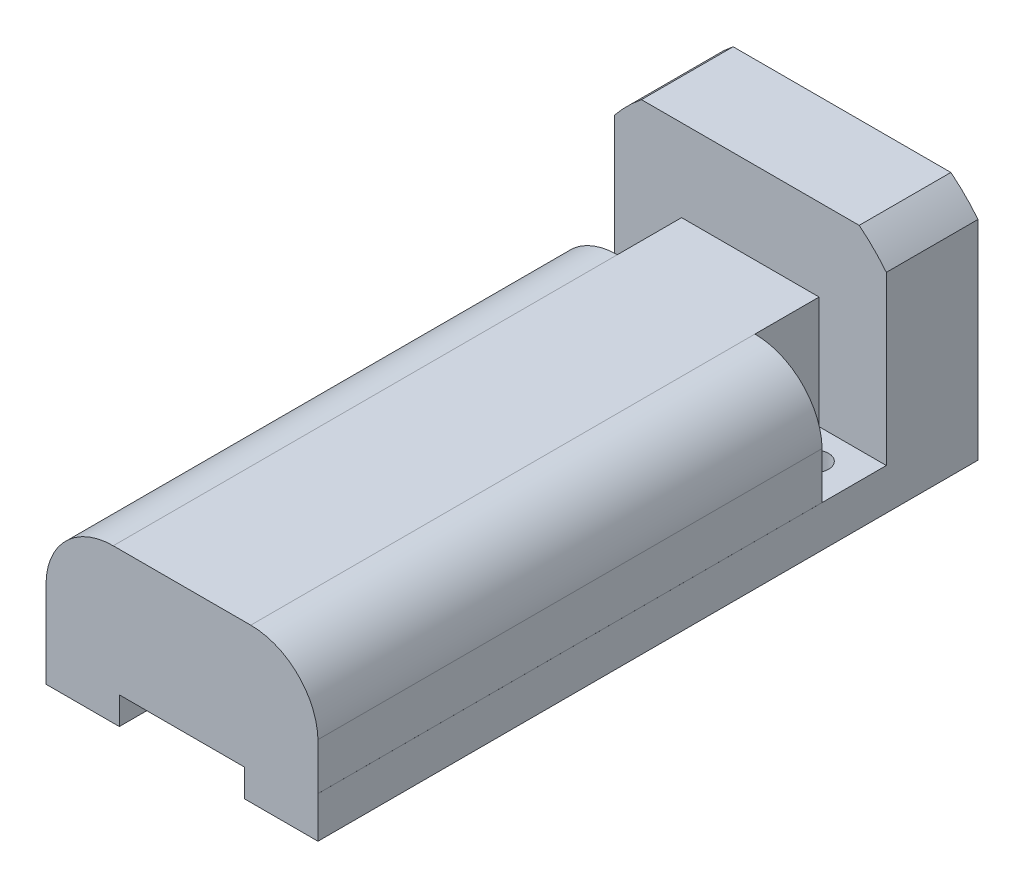
ISO-10303-21;
HEADER;
FILE_DESCRIPTION(('STEP AP214'),'2;1');
FILE_NAME('part.step','',(''),(''),'','','');
FILE_SCHEMA(('AUTOMOTIVE_DESIGN { 1 0 10303 214 1 1 1 1 }'));
ENDSEC;
DATA;
#1=APPLICATION_CONTEXT('core data for automotive mechanical design processes');
#2=APPLICATION_PROTOCOL_DEFINITION('international standard','automotive_design',2000,#1);
#3=PRODUCT_CONTEXT('',#1,'mechanical');
#4=PRODUCT('Part','Part','',(#3));
#5=PRODUCT_RELATED_PRODUCT_CATEGORY('part','',(#4));
#6=PRODUCT_DEFINITION_FORMATION('','',#4);
#7=PRODUCT_DEFINITION_CONTEXT('part definition',#1,'design');
#8=PRODUCT_DEFINITION('design','',#6,#7);
#9=PRODUCT_DEFINITION_SHAPE('','',#8);
#10=(LENGTH_UNIT() NAMED_UNIT(*) SI_UNIT(.MILLI.,.METRE.));
#11=(NAMED_UNIT(*) PLANE_ANGLE_UNIT() SI_UNIT($,.RADIAN.));
#12=(NAMED_UNIT(*) SI_UNIT($,.STERADIAN.) SOLID_ANGLE_UNIT());
#13=UNCERTAINTY_MEASURE_WITH_UNIT(LENGTH_MEASURE(1.E-05),#10,'distance_accuracy_value','');
#14=(GEOMETRIC_REPRESENTATION_CONTEXT(3) GLOBAL_UNCERTAINTY_ASSIGNED_CONTEXT((#13)) GLOBAL_UNIT_ASSIGNED_CONTEXT((#10,
#11,#12)) REPRESENTATION_CONTEXT('',''));
#15=CARTESIAN_POINT('',(0.,0.,0.));
#16=DIRECTION('',(0.,0.,1.));
#17=DIRECTION('',(1.,0.,0.));
#18=AXIS2_PLACEMENT_3D('',#15,#16,#17);
#19=CARTESIAN_POINT('',(8.35,4.5,-72.));
#20=DIRECTION('',(0.,-1.,0.));
#21=DIRECTION('',(1.,0.,0.));
#22=AXIS2_PLACEMENT_3D('',#19,#20,#21);
#23=PLANE('',#22);
#24=CARTESIAN_POINT('',(-10.5425,4.49999999999998,-58.5));
#25=DIRECTION('',(0.,1.,0.));
#26=DIRECTION('',(-1.,0.,0.));
#27=AXIS2_PLACEMENT_3D('',#24,#25,#26);
#28=CIRCLE('',#27,1.5);
#29=CARTESIAN_POINT('',(-12.0425,4.49999999999998,-58.5));
#30=VERTEX_POINT('',#29);
#31=EDGE_CURVE('E269',#30,#30,#28,.T.);
#32=ORIENTED_EDGE('',*,*,#31,.F.);
#33=EDGE_LOOP('',(#32));
#34=FACE_BOUND('',#33,.T.);
#35=DIRECTION('',(0.,0.,1.));
#36=VECTOR('',#35,1.);
#37=CARTESIAN_POINT('',(-7.5,4.5,-81.3665304068643));
#38=LINE('',#37,#36);
#39=CARTESIAN_POINT('',(-7.5,4.5,-62.));
#40=VERTEX_POINT('',#39);
#41=CARTESIAN_POINT('',(-7.5,4.5,-55.));
#42=VERTEX_POINT('',#41);
#43=EDGE_CURVE('E304',#40,#42,#38,.T.);
#44=ORIENTED_EDGE('',*,*,#43,.F.);
#45=DIRECTION('',(1.,0.,0.));
#46=VECTOR('',#45,1.);
#47=CARTESIAN_POINT('',(-14.835,4.5,-62.));
#48=LINE('',#47,#46);
#49=CARTESIAN_POINT('',(-14.835,4.5,-62.));
#50=VERTEX_POINT('',#49);
#51=EDGE_CURVE('E383',#50,#40,#48,.T.);
#52=ORIENTED_EDGE('',*,*,#51,.F.);
#53=DIRECTION('',(0.,0.,1.));
#54=VECTOR('',#53,1.);
#55=CARTESIAN_POINT('',(-14.835,4.5,-72.));
#56=LINE('',#55,#54);
#57=CARTESIAN_POINT('',(-14.835,4.5,-55.));
#58=VERTEX_POINT('',#57);
#59=EDGE_CURVE('E468',#50,#58,#56,.T.);
#60=ORIENTED_EDGE('',*,*,#59,.T.);
#61=DIRECTION('',(1.,0.,0.));
#62=VECTOR('',#61,1.);
#63=CARTESIAN_POINT('',(0.,4.5,-55.));
#64=LINE('',#63,#62);
#65=EDGE_CURVE('E331',#58,#42,#64,.T.);
#66=ORIENTED_EDGE('',*,*,#65,.T.);
#67=EDGE_LOOP('',(#44,#52,#60,#66));
#68=FACE_BOUND('',#67,.T.);
#69=ADVANCED_FACE('F47',(#34,#68),#23,.F.);
#70=CARTESIAN_POINT('',(10.5425,4.5,-58.5));
#71=DIRECTION('',(0.,1.,0.));
#72=DIRECTION('',(1.,0.,0.));
#73=AXIS2_PLACEMENT_3D('',#70,#71,#72);
#74=CIRCLE('',#73,1.5);
#75=CARTESIAN_POINT('',(12.0425,4.5,-58.5));
#76=VERTEX_POINT('',#75);
#77=EDGE_CURVE('E278',#76,#76,#74,.T.);
#78=ORIENTED_EDGE('',*,*,#77,.F.);
#79=EDGE_LOOP('',(#78));
#80=FACE_BOUND('',#79,.T.);
#81=DIRECTION('',(0.,0.,1.));
#82=VECTOR('',#81,1.);
#83=CARTESIAN_POINT('',(7.5,4.5,-81.3665304068643));
#84=LINE('',#83,#82);
#85=CARTESIAN_POINT('',(7.5,4.5,-62.));
#86=VERTEX_POINT('',#85);
#87=CARTESIAN_POINT('',(7.5,4.5,-55.));
#88=VERTEX_POINT('',#87);
#89=EDGE_CURVE('E307',#86,#88,#84,.T.);
#90=ORIENTED_EDGE('',*,*,#89,.T.);
#91=CARTESIAN_POINT('',(14.8326623480347,4.5,-55.));
#92=VERTEX_POINT('',#91);
#93=EDGE_CURVE('E71',#88,#92,#64,.T.);
#94=ORIENTED_EDGE('',*,*,#93,.T.);
#95=DIRECTION('',(0.,0.,-1.));
#96=VECTOR('',#95,1.);
#97=CARTESIAN_POINT('',(14.8326623480347,4.5,32.0972380306624));
#98=LINE('',#97,#96);
#99=CARTESIAN_POINT('',(14.8326623480347,4.5,0.));
#100=VERTEX_POINT('',#99);
#101=EDGE_CURVE('E318',#100,#92,#98,.T.);
#102=ORIENTED_EDGE('',*,*,#101,.F.);
#103=DIRECTION('',(1.,0.,0.));
#104=VECTOR('',#103,1.);
#105=CARTESIAN_POINT('',(8.35,4.5,0.));
#106=LINE('',#105,#104);
#107=CARTESIAN_POINT('',(14.835,4.5,0.));
#108=VERTEX_POINT('',#107);
#109=EDGE_CURVE('E456',#100,#108,#106,.T.);
#110=ORIENTED_EDGE('',*,*,#109,.T.);
#111=DIRECTION('',(0.,0.,1.));
#112=VECTOR('',#111,1.);
#113=CARTESIAN_POINT('',(14.835,4.5,-72.));
#114=LINE('',#113,#112);
#115=CARTESIAN_POINT('',(14.835,4.5,-62.));
#116=VERTEX_POINT('',#115);
#117=EDGE_CURVE('E464',#116,#108,#114,.T.);
#118=ORIENTED_EDGE('',*,*,#117,.F.);
#119=EDGE_CURVE('E382',#86,#116,#48,.T.);
#120=ORIENTED_EDGE('',*,*,#119,.F.);
#121=EDGE_LOOP('',(#90,#94,#102,#110,#118,#120));
#122=FACE_BOUND('',#121,.T.);
#123=ADVANCED_FACE('F514',(#80,#122),#23,.F.);
#124=CARTESIAN_POINT('',(0.00192709148594142,10.8747780814861,-62.));
#125=DIRECTION('',(0.,0.,1.));
#126=DIRECTION('',(1.,0.,0.));
#127=AXIS2_PLACEMENT_3D('',#124,#125,#126);
#128=PLANE('',#127);
#129=ORIENTED_EDGE('',*,*,#51,.T.);
#130=DIRECTION('',(0.,-1.,0.));
#131=VECTOR('',#130,1.);
#132=CARTESIAN_POINT('',(-7.5,16.75,-62.));
#133=LINE('',#132,#131);
#134=CARTESIAN_POINT('',(-7.5,16.75,-62.));
#135=VERTEX_POINT('',#134);
#136=EDGE_CURVE('E285',#135,#40,#133,.T.);
#137=ORIENTED_EDGE('',*,*,#136,.F.);
#138=DIRECTION('',(-1.,0.,0.));
#139=VECTOR('',#138,1.);
#140=CARTESIAN_POINT('',(7.5,16.75,-62.));
#141=LINE('',#140,#139);
#142=CARTESIAN_POINT('',(7.5,16.75,-62.));
#143=VERTEX_POINT('',#142);
#144=EDGE_CURVE('E289',#143,#135,#141,.T.);
#145=ORIENTED_EDGE('',*,*,#144,.F.);
#146=DIRECTION('',(0.,1.,0.));
#147=VECTOR('',#146,1.);
#148=CARTESIAN_POINT('',(7.5,16.75,-62.));
#149=LINE('',#148,#147);
#150=EDGE_CURVE('E288',#86,#143,#149,.T.);
#151=ORIENTED_EDGE('',*,*,#150,.F.);
#152=ORIENTED_EDGE('',*,*,#119,.T.);
#153=DIRECTION('',(0.,1.,0.));
#154=VECTOR('',#153,1.);
#155=CARTESIAN_POINT('',(14.835,4.5,-62.));
#156=LINE('',#155,#154);
#157=CARTESIAN_POINT('',(14.835,22.7482757992321,-62.));
#158=VERTEX_POINT('',#157);
#159=EDGE_CURVE('E387',#116,#158,#156,.T.);
#160=ORIENTED_EDGE('',*,*,#159,.T.);
#161=CARTESIAN_POINT('',(0.00192709148594142,10.8747780814861,-62.));
#162=DIRECTION('',(0.,0.,1.));
#163=DIRECTION('',(1.,0.,0.));
#164=AXIS2_PLACEMENT_3D('',#161,#162,#163);
#165=CIRCLE('',#164,18.9999999990162);
#166=CARTESIAN_POINT('',(11.8754248092322,25.70785099,-62.));
#167=VERTEX_POINT('',#166);
#168=EDGE_CURVE('E330',#158,#167,#165,.T.);
#169=ORIENTED_EDGE('',*,*,#168,.T.);
#170=DIRECTION('',(-1.,0.,0.));
#171=VECTOR('',#170,1.);
#172=CARTESIAN_POINT('',(11.8754248092322,25.70785099,-62.));
#173=LINE('',#172,#171);
#174=CARTESIAN_POINT('',(-11.8754248092322,25.70785099,-62.));
#175=VERTEX_POINT('',#174);
#176=EDGE_CURVE('E370',#167,#175,#173,.T.);
#177=ORIENTED_EDGE('',*,*,#176,.T.);
#178=CARTESIAN_POINT('',(-0.00192709148594142,10.8747780814861,-62.));
#179=DIRECTION('',(0.,0.,1.));
#180=DIRECTION('',(1.,0.,0.));
#181=AXIS2_PLACEMENT_3D('',#178,#179,#180);
#182=CIRCLE('',#181,18.9999999990162);
#183=CARTESIAN_POINT('',(-14.835,22.7482757992321,-62.));
#184=VERTEX_POINT('',#183);
#185=EDGE_CURVE('E374',#175,#184,#182,.T.);
#186=ORIENTED_EDGE('',*,*,#185,.T.);
#187=DIRECTION('',(0.,-1.,0.));
#188=VECTOR('',#187,1.);
#189=CARTESIAN_POINT('',(-14.835,4.5,-62.));
#190=LINE('',#189,#188);
#191=EDGE_CURVE('E378',#184,#50,#190,.T.);
#192=ORIENTED_EDGE('',*,*,#191,.T.);
#193=EDGE_LOOP('',(#129,#137,#145,#151,#152,#160,#169,#177,#186,#192));
#194=FACE_BOUND('',#193,.T.);
#195=ADVANCED_FACE('F510',(#194),#128,.T.);
#196=CARTESIAN_POINT('',(0.,0.,-55.));
#197=DIRECTION('',(0.,0.,1.));
#198=DIRECTION('',(1.,0.,0.));
#199=AXIS2_PLACEMENT_3D('',#196,#197,#198);
#200=PLANE('',#199);
#201=DIRECTION('',(0.,1.,0.));
#202=VECTOR('',#201,1.);
#203=CARTESIAN_POINT('',(-7.5,16.75,-55.));
#204=LINE('',#203,#202);
#205=CARTESIAN_POINT('',(-7.5,16.75,-55.));
#206=VERTEX_POINT('',#205);
#207=EDGE_CURVE('E294',#42,#206,#204,.T.);
#208=ORIENTED_EDGE('',*,*,#207,.F.);
#209=ORIENTED_EDGE('',*,*,#65,.F.);
#210=DIRECTION('',(0.,-1.,0.));
#211=VECTOR('',#210,1.);
#212=CARTESIAN_POINT('',(-14.835,0.,-55.));
#213=LINE('',#212,#211);
#214=CARTESIAN_POINT('',(-14.835,9.41500000000001,-55.));
#215=VERTEX_POINT('',#214);
#216=EDGE_CURVE('E347',#215,#58,#213,.T.);
#217=ORIENTED_EDGE('',*,*,#216,.F.);
#218=CARTESIAN_POINT('',(-7.5,9.415,-55.));
#219=DIRECTION('',(0.,0.,1.));
#220=DIRECTION('',(1.,0.,0.));
#221=AXIS2_PLACEMENT_3D('',#218,#219,#220);
#222=CIRCLE('',#221,7.335);
#223=EDGE_CURVE('E343',#206,#215,#222,.T.);
#224=ORIENTED_EDGE('',*,*,#223,.F.);
#225=EDGE_LOOP('',(#208,#209,#217,#224));
#226=FACE_BOUND('',#225,.T.);
#227=ADVANCED_FACE('F549',(#226),#200,.F.);
#228=DIRECTION('',(0.,-1.,0.));
#229=VECTOR('',#228,1.);
#230=CARTESIAN_POINT('',(7.5,16.75,-55.));
#231=LINE('',#230,#229);
#232=CARTESIAN_POINT('',(7.5,16.75,-55.));
#233=VERTEX_POINT('',#232);
#234=EDGE_CURVE('E273',#233,#88,#231,.T.);
#235=ORIENTED_EDGE('',*,*,#234,.F.);
#236=CARTESIAN_POINT('',(7.5,9.415,-55.));
#237=DIRECTION('',(0.,0.,1.));
#238=DIRECTION('',(1.,0.,0.));
#239=AXIS2_PLACEMENT_3D('',#236,#237,#238);
#240=CIRCLE('',#239,7.335);
#241=CARTESIAN_POINT('',(14.8326623480347,9.60016989418844,-55.));
#242=VERTEX_POINT('',#241);
#243=EDGE_CURVE('E339',#242,#233,#240,.T.);
#244=ORIENTED_EDGE('',*,*,#243,.F.);
#245=DIRECTION('',(0.,1.,0.));
#246=VECTOR('',#245,1.);
#247=CARTESIAN_POINT('',(14.8326623480347,0.,-55.));
#248=LINE('',#247,#246);
#249=EDGE_CURVE('E335',#92,#242,#248,.T.);
#250=ORIENTED_EDGE('',*,*,#249,.F.);
#251=ORIENTED_EDGE('',*,*,#93,.F.);
#252=EDGE_LOOP('',(#235,#244,#250,#251));
#253=FACE_BOUND('',#252,.T.);
#254=ADVANCED_FACE('F564',(#253),#200,.F.);
#255=CARTESIAN_POINT('',(0.,0.,-72.));
#256=DIRECTION('',(0.,0.,-1.));
#257=DIRECTION('',(-1.,0.,0.));
#258=AXIS2_PLACEMENT_3D('',#255,#256,#257);
#259=PLANE('',#258);
#260=DIRECTION('',(0.,1.,0.));
#261=VECTOR('',#260,1.);
#262=CARTESIAN_POINT('',(-11.85,22.72285099,-72.));
#263=LINE('',#262,#261);
#264=CARTESIAN_POINT('',(-11.85,0.,-72.));
#265=VERTEX_POINT('',#264);
#266=CARTESIAN_POINT('',(-11.85,22.72285099,-72.));
#267=VERTEX_POINT('',#266);
#268=EDGE_CURVE('E235',#265,#267,#263,.T.);
#269=ORIENTED_EDGE('',*,*,#268,.F.);
#270=DIRECTION('',(1.,0.,0.));
#271=VECTOR('',#270,1.);
#272=CARTESIAN_POINT('',(-14.835,0.,-72.));
#273=LINE('',#272,#271);
#274=CARTESIAN_POINT('',(-14.835,0.,-72.));
#275=VERTEX_POINT('',#274);
#276=EDGE_CURVE('E420',#275,#265,#273,.T.);
#277=ORIENTED_EDGE('',*,*,#276,.F.);
#278=DIRECTION('',(0.,1.,0.));
#279=VECTOR('',#278,1.);
#280=CARTESIAN_POINT('',(-14.835,0.,-72.));
#281=LINE('',#280,#279);
#282=CARTESIAN_POINT('',(-14.835,22.7482757992321,-72.));
#283=VERTEX_POINT('',#282);
#284=EDGE_CURVE('E425',#275,#283,#281,.T.);
#285=ORIENTED_EDGE('',*,*,#284,.T.);
#286=CARTESIAN_POINT('',(-0.00192709148594142,10.8747780814861,-72.));
#287=DIRECTION('',(0.,0.,1.));
#288=DIRECTION('',(1.,0.,0.));
#289=AXIS2_PLACEMENT_3D('',#286,#287,#288);
#290=CIRCLE('',#289,18.9999999990162);
#291=CARTESIAN_POINT('',(-11.8754248092322,25.70785099,-72.));
#292=VERTEX_POINT('',#291);
#293=EDGE_CURVE('E391',#292,#283,#290,.T.);
#294=ORIENTED_EDGE('',*,*,#293,.F.);
#295=DIRECTION('',(-1.,0.,0.));
#296=VECTOR('',#295,1.);
#297=CARTESIAN_POINT('',(0.,25.70785099,-72.));
#298=LINE('',#297,#296);
#299=CARTESIAN_POINT('',(11.8754248092322,25.70785099,-72.));
#300=VERTEX_POINT('',#299);
#301=EDGE_CURVE('E411',#300,#292,#298,.T.);
#302=ORIENTED_EDGE('',*,*,#301,.F.);
#303=CARTESIAN_POINT('',(0.00192709148594142,10.8747780814861,-72.));
#304=DIRECTION('',(0.,0.,1.));
#305=DIRECTION('',(-1.,0.,0.));
#306=AXIS2_PLACEMENT_3D('',#303,#304,#305);
#307=CIRCLE('',#306,18.9999999990162);
#308=CARTESIAN_POINT('',(14.835,22.7482757992321,-72.));
#309=VERTEX_POINT('',#308);
#310=EDGE_CURVE('E392',#309,#300,#307,.T.);
#311=ORIENTED_EDGE('',*,*,#310,.F.);
#312=DIRECTION('',(0.,1.,0.));
#313=VECTOR('',#312,1.);
#314=CARTESIAN_POINT('',(14.835,0.,-72.));
#315=LINE('',#314,#313);
#316=CARTESIAN_POINT('',(14.835,0.,-72.));
#317=VERTEX_POINT('',#316);
#318=EDGE_CURVE('E429',#317,#309,#315,.T.);
#319=ORIENTED_EDGE('',*,*,#318,.F.);
#320=DIRECTION('',(-1.,0.,0.));
#321=VECTOR('',#320,1.);
#322=CARTESIAN_POINT('',(14.835,0.,-72.));
#323=LINE('',#322,#321);
#324=CARTESIAN_POINT('',(11.85,0.,-72.));
#325=VERTEX_POINT('',#324);
#326=EDGE_CURVE('E416',#317,#325,#323,.T.);
#327=ORIENTED_EDGE('',*,*,#326,.T.);
#328=DIRECTION('',(0.,-1.,0.));
#329=VECTOR('',#328,1.);
#330=CARTESIAN_POINT('',(11.85,0.,-72.));
#331=LINE('',#330,#329);
#332=CARTESIAN_POINT('',(11.85,22.72285099,-72.));
#333=VERTEX_POINT('',#332);
#334=EDGE_CURVE('E239',#333,#325,#331,.T.);
#335=ORIENTED_EDGE('',*,*,#334,.F.);
#336=DIRECTION('',(1.,0.,0.));
#337=VECTOR('',#336,1.);
#338=CARTESIAN_POINT('',(11.85,22.72285099,-72.));
#339=LINE('',#338,#337);
#340=EDGE_CURVE('E217',#267,#333,#339,.T.);
#341=ORIENTED_EDGE('',*,*,#340,.F.);
#342=EDGE_LOOP('',(#269,#277,#285,#294,#302,#311,#319,#327,#335,#341));
#343=FACE_BOUND('',#342,.T.);
#344=ADVANCED_FACE('F525',(#343),#259,.T.);
#345=CARTESIAN_POINT('',(14.835,0.,-72.));
#346=DIRECTION('',(0.,1.,0.));
#347=DIRECTION('',(0.,0.,1.));
#348=AXIS2_PLACEMENT_3D('',#345,#346,#347);
#349=PLANE('',#348);
#350=CARTESIAN_POINT('',(10.5425,0.,-58.5));
#351=DIRECTION('',(0.,1.,0.));
#352=DIRECTION('',(0.,0.,1.));
#353=AXIS2_PLACEMENT_3D('',#350,#351,#352);
#354=CIRCLE('',#353,1.5);
#355=CARTESIAN_POINT('',(10.5425,0.,-57.));
#356=VERTEX_POINT('',#355);
#357=EDGE_CURVE('E268',#356,#356,#354,.F.);
#358=ORIENTED_EDGE('',*,*,#357,.F.);
#359=EDGE_LOOP('',(#358));
#360=FACE_BOUND('',#359,.T.);
#361=DIRECTION('',(-1.,0.,0.));
#362=VECTOR('',#361,1.);
#363=CARTESIAN_POINT('',(11.85,0.,-65.));
#364=LINE('',#363,#362);
#365=CARTESIAN_POINT('',(11.85,0.,-65.));
#366=VERTEX_POINT('',#365);
#367=CARTESIAN_POINT('',(6.83500000000001,0.,-65.));
#368=VERTEX_POINT('',#367);
#369=EDGE_CURVE('E242',#366,#368,#364,.T.);
#370=ORIENTED_EDGE('',*,*,#369,.F.);
#371=DIRECTION('',(0.,0.,-1.));
#372=VECTOR('',#371,1.);
#373=CARTESIAN_POINT('',(11.85,0.,-65.));
#374=LINE('',#373,#372);
#375=EDGE_CURVE('E221',#366,#325,#374,.T.);
#376=ORIENTED_EDGE('',*,*,#375,.T.);
#377=ORIENTED_EDGE('',*,*,#326,.F.);
#378=DIRECTION('',(0.,0.,1.));
#379=VECTOR('',#378,1.);
#380=CARTESIAN_POINT('',(14.835,0.,-72.));
#381=LINE('',#380,#379);
#382=CARTESIAN_POINT('',(14.835,0.,0.));
#383=VERTEX_POINT('',#382);
#384=EDGE_CURVE('E433',#317,#383,#381,.T.);
#385=ORIENTED_EDGE('',*,*,#384,.T.);
#386=DIRECTION('',(-1.,0.,0.));
#387=VECTOR('',#386,1.);
#388=CARTESIAN_POINT('',(14.835,0.,0.));
#389=LINE('',#388,#387);
#390=CARTESIAN_POINT('',(6.835,0.,0.));
#391=VERTEX_POINT('',#390);
#392=EDGE_CURVE('E415',#383,#391,#389,.T.);
#393=ORIENTED_EDGE('',*,*,#392,.T.);
#394=DIRECTION('',(0.,0.,1.));
#395=VECTOR('',#394,1.);
#396=CARTESIAN_POINT('',(6.835,0.,-72.));
#397=LINE('',#396,#395);
#398=EDGE_CURVE('E11',#368,#391,#397,.T.);
#399=ORIENTED_EDGE('',*,*,#398,.F.);
#400=EDGE_LOOP('',(#370,#376,#377,#385,#393,#399));
#401=FACE_BOUND('',#400,.T.);
#402=ADVANCED_FACE('F49',(#360,#401),#349,.F.);
#403=CARTESIAN_POINT('',(6.835,0.,-72.));
#404=DIRECTION('',(1.,0.,0.));
#405=DIRECTION('',(0.,0.,-1.));
#406=AXIS2_PLACEMENT_3D('',#403,#404,#405);
#407=PLANE('',#406);
#408=DIRECTION('',(0.,0.,1.));
#409=VECTOR('',#408,1.);
#410=CARTESIAN_POINT('',(6.835,3.,-72.));
#411=LINE('',#410,#409);
#412=CARTESIAN_POINT('',(6.835,3.,-65.));
#413=VERTEX_POINT('',#412);
#414=CARTESIAN_POINT('',(6.835,3.,0.));
#415=VERTEX_POINT('',#414);
#416=EDGE_CURVE('E56',#413,#415,#411,.T.);
#417=ORIENTED_EDGE('',*,*,#416,.F.);
#418=DIRECTION('',(0.,-1.,0.));
#419=VECTOR('',#418,1.);
#420=CARTESIAN_POINT('',(6.835,0.,-65.));
#421=LINE('',#420,#419);
#422=EDGE_CURVE('E264',#413,#368,#421,.T.);
#423=ORIENTED_EDGE('',*,*,#422,.T.);
#424=ORIENTED_EDGE('',*,*,#398,.T.);
#425=DIRECTION('',(0.,1.,0.));
#426=VECTOR('',#425,1.);
#427=CARTESIAN_POINT('',(6.835,0.,0.));
#428=LINE('',#427,#426);
#429=EDGE_CURVE('E437',#391,#415,#428,.T.);
#430=ORIENTED_EDGE('',*,*,#429,.T.);
#431=EDGE_LOOP('',(#417,#423,#424,#430));
#432=FACE_BOUND('',#431,.T.);
#433=ADVANCED_FACE('F488',(#432),#407,.F.);
#434=CARTESIAN_POINT('',(-6.835,3.,-72.));
#435=DIRECTION('',(0.,-1.,0.));
#436=DIRECTION('',(0.,0.,-1.));
#437=AXIS2_PLACEMENT_3D('',#434,#435,#436);
#438=PLANE('',#437);
#439=DIRECTION('',(-1.,0.,0.));
#440=VECTOR('',#439,1.);
#441=CARTESIAN_POINT('',(-6.835,3.,-65.));
#442=LINE('',#441,#440);
#443=CARTESIAN_POINT('',(-6.835,3.,-65.));
#444=VERTEX_POINT('',#443);
#445=EDGE_CURVE('E261',#413,#444,#442,.T.);
#446=ORIENTED_EDGE('',*,*,#445,.F.);
#447=ORIENTED_EDGE('',*,*,#416,.T.);
#448=DIRECTION('',(1.,0.,0.));
#449=VECTOR('',#448,1.);
#450=CARTESIAN_POINT('',(-6.835,3.,0.));
#451=LINE('',#450,#449);
#452=CARTESIAN_POINT('',(-6.835,3.,0.));
#453=VERTEX_POINT('',#452);
#454=EDGE_CURVE('E441',#453,#415,#451,.T.);
#455=ORIENTED_EDGE('',*,*,#454,.F.);
#456=DIRECTION('',(0.,0.,1.));
#457=VECTOR('',#456,1.);
#458=CARTESIAN_POINT('',(-6.835,3.,-72.));
#459=LINE('',#458,#457);
#460=EDGE_CURVE('E477',#444,#453,#459,.T.);
#461=ORIENTED_EDGE('',*,*,#460,.F.);
#462=EDGE_LOOP('',(#446,#447,#455,#461));
#463=FACE_BOUND('',#462,.T.);
#464=ADVANCED_FACE('F484',(#463),#438,.T.);
#465=CARTESIAN_POINT('',(-6.835,0.,-72.));
#466=DIRECTION('',(1.,0.,0.));
#467=DIRECTION('',(0.,0.,-1.));
#468=AXIS2_PLACEMENT_3D('',#465,#466,#467);
#469=PLANE('',#468);
#470=DIRECTION('',(0.,-1.,0.));
#471=VECTOR('',#470,1.);
#472=CARTESIAN_POINT('',(-6.835,0.,-65.));
#473=LINE('',#472,#471);
#474=CARTESIAN_POINT('',(-6.835,0.,-65.));
#475=VERTEX_POINT('',#474);
#476=EDGE_CURVE('E63',#444,#475,#473,.T.);
#477=ORIENTED_EDGE('',*,*,#476,.F.);
#478=ORIENTED_EDGE('',*,*,#460,.T.);
#479=DIRECTION('',(0.,1.,0.));
#480=VECTOR('',#479,1.);
#481=CARTESIAN_POINT('',(-6.835,0.,0.));
#482=LINE('',#481,#480);
#483=CARTESIAN_POINT('',(-6.835,0.,0.));
#484=VERTEX_POINT('',#483);
#485=EDGE_CURVE('E445',#484,#453,#482,.T.);
#486=ORIENTED_EDGE('',*,*,#485,.F.);
#487=DIRECTION('',(0.,0.,1.));
#488=VECTOR('',#487,1.);
#489=CARTESIAN_POINT('',(-6.835,0.,-72.));
#490=LINE('',#489,#488);
#491=EDGE_CURVE('E474',#475,#484,#490,.T.);
#492=ORIENTED_EDGE('',*,*,#491,.F.);
#493=EDGE_LOOP('',(#477,#478,#486,#492));
#494=FACE_BOUND('',#493,.T.);
#495=ADVANCED_FACE('F498',(#494),#469,.T.);
#496=CARTESIAN_POINT('',(-14.835,0.,-72.));
#497=DIRECTION('',(0.,-1.,0.));
#498=DIRECTION('',(0.,0.,-1.));
#499=AXIS2_PLACEMENT_3D('',#496,#497,#498);
#500=PLANE('',#499);
#501=DIRECTION('',(0.,0.,-1.));
#502=VECTOR('',#501,1.);
#503=CARTESIAN_POINT('',(-11.85,0.,-65.));
#504=LINE('',#503,#502);
#505=CARTESIAN_POINT('',(-11.85,0.,-65.));
#506=VERTEX_POINT('',#505);
#507=EDGE_CURVE('E254',#506,#265,#504,.T.);
#508=ORIENTED_EDGE('',*,*,#507,.F.);
#509=EDGE_CURVE('E230',#475,#506,#364,.T.);
#510=ORIENTED_EDGE('',*,*,#509,.F.);
#511=ORIENTED_EDGE('',*,*,#491,.T.);
#512=DIRECTION('',(1.,0.,0.));
#513=VECTOR('',#512,1.);
#514=CARTESIAN_POINT('',(-14.835,0.,0.));
#515=LINE('',#514,#513);
#516=CARTESIAN_POINT('',(-14.835,0.,0.));
#517=VERTEX_POINT('',#516);
#518=EDGE_CURVE('E449',#517,#484,#515,.T.);
#519=ORIENTED_EDGE('',*,*,#518,.F.);
#520=DIRECTION('',(0.,0.,1.));
#521=VECTOR('',#520,1.);
#522=CARTESIAN_POINT('',(-14.835,0.,-72.));
#523=LINE('',#522,#521);
#524=EDGE_CURVE('E471',#275,#517,#523,.T.);
#525=ORIENTED_EDGE('',*,*,#524,.F.);
#526=ORIENTED_EDGE('',*,*,#276,.T.);
#527=EDGE_LOOP('',(#508,#510,#511,#519,#525,#526));
#528=FACE_BOUND('',#527,.T.);
#529=CARTESIAN_POINT('',(-10.5425,0.,-58.5));
#530=DIRECTION('',(0.,-1.,0.));
#531=DIRECTION('',(0.,0.,-1.));
#532=AXIS2_PLACEMENT_3D('',#529,#530,#531);
#533=CIRCLE('',#532,1.5);
#534=CARTESIAN_POINT('',(-10.5425,0.,-60.));
#535=VERTEX_POINT('',#534);
#536=EDGE_CURVE('E274',#535,#535,#533,.F.);
#537=ORIENTED_EDGE('',*,*,#536,.T.);
#538=EDGE_LOOP('',(#537));
#539=FACE_BOUND('',#538,.T.);
#540=ADVANCED_FACE('F501',(#528,#539),#500,.T.);
#541=CARTESIAN_POINT('',(-14.835,0.,-72.));
#542=DIRECTION('',(1.,0.,0.));
#543=DIRECTION('',(0.,1.,0.));
#544=AXIS2_PLACEMENT_3D('',#541,#542,#543);
#545=PLANE('',#544);
#546=ORIENTED_EDGE('',*,*,#191,.F.);
#547=DIRECTION('',(0.,0.,-1.));
#548=VECTOR('',#547,1.);
#549=CARTESIAN_POINT('',(-14.835,22.7482757992321,-62.2561154477179));
#550=LINE('',#549,#548);
#551=EDGE_CURVE('E400',#184,#283,#550,.T.);
#552=ORIENTED_EDGE('',*,*,#551,.T.);
#553=ORIENTED_EDGE('',*,*,#284,.F.);
#554=ORIENTED_EDGE('',*,*,#524,.T.);
#555=DIRECTION('',(0.,1.,0.));
#556=VECTOR('',#555,1.);
#557=CARTESIAN_POINT('',(-14.835,0.,0.));
#558=LINE('',#557,#556);
#559=CARTESIAN_POINT('',(-14.835,9.41500000000001,0.));
#560=VERTEX_POINT('',#559);
#561=EDGE_CURVE('E453',#517,#560,#558,.T.);
#562=ORIENTED_EDGE('',*,*,#561,.T.);
#563=DIRECTION('',(0.,0.,-1.));
#564=VECTOR('',#563,1.);
#565=CARTESIAN_POINT('',(-14.835,9.41500000000001,32.0972380306624));
#566=LINE('',#565,#564);
#567=EDGE_CURVE('E351',#560,#215,#566,.T.);
#568=ORIENTED_EDGE('',*,*,#567,.T.);
#569=ORIENTED_EDGE('',*,*,#216,.T.);
#570=ORIENTED_EDGE('',*,*,#59,.F.);
#571=EDGE_LOOP('',(#546,#552,#553,#554,#562,#568,#569,#570));
#572=FACE_BOUND('',#571,.T.);
#573=ADVANCED_FACE('F536',(#572),#545,.F.);
#574=CARTESIAN_POINT('',(14.835,0.,-72.));
#575=DIRECTION('',(1.,0.,0.));
#576=DIRECTION('',(0.,0.,-1.));
#577=AXIS2_PLACEMENT_3D('',#574,#575,#576);
#578=PLANE('',#577);
#579=ORIENTED_EDGE('',*,*,#159,.F.);
#580=ORIENTED_EDGE('',*,*,#117,.T.);
#581=DIRECTION('',(0.,1.,0.));
#582=VECTOR('',#581,1.);
#583=CARTESIAN_POINT('',(14.835,0.,0.));
#584=LINE('',#583,#582);
#585=EDGE_CURVE('E421',#383,#108,#584,.T.);
#586=ORIENTED_EDGE('',*,*,#585,.F.);
#587=ORIENTED_EDGE('',*,*,#384,.F.);
#588=ORIENTED_EDGE('',*,*,#318,.T.);
#589=DIRECTION('',(0.,0.,-1.));
#590=VECTOR('',#589,1.);
#591=CARTESIAN_POINT('',(14.835,22.7482757992321,-62.2561154477179));
#592=LINE('',#591,#590);
#593=EDGE_CURVE('E408',#158,#309,#592,.T.);
#594=ORIENTED_EDGE('',*,*,#593,.F.);
#595=EDGE_LOOP('',(#579,#580,#586,#587,#588,#594));
#596=FACE_BOUND('',#595,.T.);
#597=ADVANCED_FACE('F517',(#596),#578,.T.);
#598=CARTESIAN_POINT('',(0.,0.,0.));
#599=DIRECTION('',(0.,0.,-1.));
#600=DIRECTION('',(-1.,0.,0.));
#601=AXIS2_PLACEMENT_3D('',#598,#599,#600);
#602=PLANE('',#601);
#603=ORIENTED_EDGE('',*,*,#392,.F.);
#604=ORIENTED_EDGE('',*,*,#585,.T.);
#605=ORIENTED_EDGE('',*,*,#109,.F.);
#606=DIRECTION('',(0.,-1.,0.));
#607=VECTOR('',#606,1.);
#608=CARTESIAN_POINT('',(14.8326623480347,0.,0.));
#609=LINE('',#608,#607);
#610=CARTESIAN_POINT('',(14.8326623480347,9.60016989418844,0.));
#611=VERTEX_POINT('',#610);
#612=EDGE_CURVE('E326',#611,#100,#609,.T.);
#613=ORIENTED_EDGE('',*,*,#612,.F.);
#614=CARTESIAN_POINT('',(7.5,9.415,0.));
#615=DIRECTION('',(0.,0.,-1.));
#616=DIRECTION('',(-1.,0.,0.));
#617=AXIS2_PLACEMENT_3D('',#614,#615,#616);
#618=CIRCLE('',#617,7.335);
#619=CARTESIAN_POINT('',(7.5,16.75,0.));
#620=VERTEX_POINT('',#619);
#621=EDGE_CURVE('E322',#620,#611,#618,.T.);
#622=ORIENTED_EDGE('',*,*,#621,.F.);
#623=DIRECTION('',(1.,0.,0.));
#624=VECTOR('',#623,1.);
#625=CARTESIAN_POINT('',(0.,16.75,0.));
#626=LINE('',#625,#624);
#627=CARTESIAN_POINT('',(-7.5,16.75,0.));
#628=VERTEX_POINT('',#627);
#629=EDGE_CURVE('E317',#628,#620,#626,.T.);
#630=ORIENTED_EDGE('',*,*,#629,.F.);
#631=CARTESIAN_POINT('',(-7.5,9.415,0.));
#632=DIRECTION('',(0.,0.,-1.));
#633=DIRECTION('',(-1.,0.,0.));
#634=AXIS2_PLACEMENT_3D('',#631,#632,#633);
#635=CIRCLE('',#634,7.335);
#636=EDGE_CURVE('E313',#560,#628,#635,.T.);
#637=ORIENTED_EDGE('',*,*,#636,.F.);
#638=ORIENTED_EDGE('',*,*,#561,.F.);
#639=ORIENTED_EDGE('',*,*,#518,.T.);
#640=ORIENTED_EDGE('',*,*,#485,.T.);
#641=ORIENTED_EDGE('',*,*,#454,.T.);
#642=ORIENTED_EDGE('',*,*,#429,.F.);
#643=EDGE_LOOP('',(#603,#604,#605,#613,#622,#630,#637,#638,#639,#640,#641,#642));
#644=FACE_BOUND('',#643,.T.);
#645=ADVANCED_FACE('F492',(#644),#602,.F.);
#646=CARTESIAN_POINT('',(0.,25.70785099,-67.));
#647=DIRECTION('',(0.,-1.,0.));
#648=DIRECTION('',(0.,0.,-1.));
#649=AXIS2_PLACEMENT_3D('',#646,#647,#648);
#650=PLANE('',#649);
#651=DIRECTION('',(0.,0.,-1.));
#652=VECTOR('',#651,1.);
#653=CARTESIAN_POINT('',(-11.8754248092322,25.70785099,-62.2561154477179));
#654=LINE('',#653,#652);
#655=EDGE_CURVE('E395',#292,#175,#654,.F.);
#656=ORIENTED_EDGE('',*,*,#655,.T.);
#657=ORIENTED_EDGE('',*,*,#176,.F.);
#658=DIRECTION('',(0.,0.,-1.));
#659=VECTOR('',#658,1.);
#660=CARTESIAN_POINT('',(11.8754248092322,25.70785099,-62.2561154477179));
#661=LINE('',#660,#659);
#662=EDGE_CURVE('E404',#167,#300,#661,.T.);
#663=ORIENTED_EDGE('',*,*,#662,.T.);
#664=ORIENTED_EDGE('',*,*,#301,.T.);
#665=EDGE_LOOP('',(#656,#657,#663,#664));
#666=FACE_BOUND('',#665,.T.);
#667=ADVANCED_FACE('F528',(#666),#650,.F.);
#668=CARTESIAN_POINT('',(-0.00192709148594142,10.8747780814861,-62.2561154477179));
#669=DIRECTION('',(0.,0.,-1.));
#670=DIRECTION('',(-1.,0.,0.));
#671=AXIS2_PLACEMENT_3D('',#668,#669,#670);
#672=CYLINDRICAL_SURFACE('',#671,18.9999999990162);
#673=ORIENTED_EDGE('',*,*,#551,.F.);
#674=ORIENTED_EDGE('',*,*,#185,.F.);
#675=ORIENTED_EDGE('',*,*,#655,.F.);
#676=ORIENTED_EDGE('',*,*,#293,.T.);
#677=EDGE_LOOP('',(#673,#674,#675,#676));
#678=FACE_BOUND('',#677,.T.);
#679=ADVANCED_FACE('F533',(#678),#672,.T.);
#680=CARTESIAN_POINT('',(0.00192709148594142,10.8747780814861,-62.2561154477179));
#681=DIRECTION('',(0.,0.,-1.));
#682=DIRECTION('',(-1.,0.,0.));
#683=AXIS2_PLACEMENT_3D('',#680,#681,#682);
#684=CYLINDRICAL_SURFACE('',#683,18.9999999990162);
#685=ORIENTED_EDGE('',*,*,#593,.T.);
#686=ORIENTED_EDGE('',*,*,#310,.T.);
#687=ORIENTED_EDGE('',*,*,#662,.F.);
#688=ORIENTED_EDGE('',*,*,#168,.F.);
#689=EDGE_LOOP('',(#685,#686,#687,#688));
#690=FACE_BOUND('',#689,.T.);
#691=ADVANCED_FACE('F521',(#690),#684,.T.);
#692=CARTESIAN_POINT('',(-7.5,9.415,32.0972380306624));
#693=DIRECTION('',(0.,0.,-1.));
#694=DIRECTION('',(-1.,0.,0.));
#695=AXIS2_PLACEMENT_3D('',#692,#693,#694);
#696=CYLINDRICAL_SURFACE('',#695,7.335);
#697=ORIENTED_EDGE('',*,*,#567,.F.);
#698=ORIENTED_EDGE('',*,*,#636,.T.);
#699=DIRECTION('',(0.,0.,-1.));
#700=VECTOR('',#699,1.);
#701=CARTESIAN_POINT('',(-7.5,16.75,32.0972380306624));
#702=LINE('',#701,#700);
#703=EDGE_CURVE('E354',#628,#206,#702,.T.);
#704=ORIENTED_EDGE('',*,*,#703,.T.);
#705=ORIENTED_EDGE('',*,*,#223,.T.);
#706=EDGE_LOOP('',(#697,#698,#704,#705));
#707=FACE_BOUND('',#706,.T.);
#708=ADVANCED_FACE('F543',(#707),#696,.T.);
#709=CARTESIAN_POINT('',(0.,16.75,32.0972380306624));
#710=DIRECTION('',(0.,-1.,0.));
#711=DIRECTION('',(1.,0.,0.));
#712=AXIS2_PLACEMENT_3D('',#709,#710,#711);
#713=PLANE('',#712);
#714=ORIENTED_EDGE('',*,*,#703,.F.);
#715=ORIENTED_EDGE('',*,*,#629,.T.);
#716=DIRECTION('',(0.,0.,-1.));
#717=VECTOR('',#716,1.);
#718=CARTESIAN_POINT('',(7.5,16.75,32.0972380306624));
#719=LINE('',#718,#717);
#720=EDGE_CURVE('E358',#620,#233,#719,.T.);
#721=ORIENTED_EDGE('',*,*,#720,.T.);
#722=DIRECTION('',(0.,0.,1.));
#723=VECTOR('',#722,1.);
#724=CARTESIAN_POINT('',(7.5,16.75,-81.3665304068643));
#725=LINE('',#724,#723);
#726=EDGE_CURVE('E297',#143,#233,#725,.T.);
#727=ORIENTED_EDGE('',*,*,#726,.F.);
#728=ORIENTED_EDGE('',*,*,#144,.T.);
#729=DIRECTION('',(0.,0.,1.));
#730=VECTOR('',#729,1.);
#731=CARTESIAN_POINT('',(-7.5,16.75,-81.3665304068643));
#732=LINE('',#731,#730);
#733=EDGE_CURVE('E300',#135,#206,#732,.T.);
#734=ORIENTED_EDGE('',*,*,#733,.T.);
#735=EDGE_LOOP('',(#714,#715,#721,#727,#728,#734));
#736=FACE_BOUND('',#735,.T.);
#737=ADVANCED_FACE('F557',(#736),#713,.F.);
#738=CARTESIAN_POINT('',(7.5,9.415,32.0972380306624));
#739=DIRECTION('',(0.,0.,-1.));
#740=DIRECTION('',(-1.,0.,0.));
#741=AXIS2_PLACEMENT_3D('',#738,#739,#740);
#742=CYLINDRICAL_SURFACE('',#741,7.335);
#743=ORIENTED_EDGE('',*,*,#720,.F.);
#744=ORIENTED_EDGE('',*,*,#621,.T.);
#745=DIRECTION('',(0.,0.,-1.));
#746=VECTOR('',#745,1.);
#747=CARTESIAN_POINT('',(14.8326623480347,9.60016989418844,32.0972380306624));
#748=LINE('',#747,#746);
#749=EDGE_CURVE('E362',#611,#242,#748,.T.);
#750=ORIENTED_EDGE('',*,*,#749,.T.);
#751=ORIENTED_EDGE('',*,*,#243,.T.);
#752=EDGE_LOOP('',(#743,#744,#750,#751));
#753=FACE_BOUND('',#752,.T.);
#754=ADVANCED_FACE('F726',(#753),#742,.T.);
#755=CARTESIAN_POINT('',(14.8326623480347,0.,32.0972380306624));
#756=DIRECTION('',(-1.,0.,0.));
#757=DIRECTION('',(0.,-1.,0.));
#758=AXIS2_PLACEMENT_3D('',#755,#756,#757);
#759=PLANE('',#758);
#760=ORIENTED_EDGE('',*,*,#749,.F.);
#761=ORIENTED_EDGE('',*,*,#612,.T.);
#762=ORIENTED_EDGE('',*,*,#101,.T.);
#763=ORIENTED_EDGE('',*,*,#249,.T.);
#764=EDGE_LOOP('',(#760,#761,#762,#763));
#765=FACE_BOUND('',#764,.T.);
#766=ADVANCED_FACE('F568',(#765),#759,.F.);
#767=CARTESIAN_POINT('',(-7.5,16.75,-81.3665304068643));
#768=DIRECTION('',(1.,0.,0.));
#769=DIRECTION('',(0.,1.,0.));
#770=AXIS2_PLACEMENT_3D('',#767,#768,#769);
#771=PLANE('',#770);
#772=ORIENTED_EDGE('',*,*,#733,.F.);
#773=ORIENTED_EDGE('',*,*,#136,.T.);
#774=ORIENTED_EDGE('',*,*,#43,.T.);
#775=ORIENTED_EDGE('',*,*,#207,.T.);
#776=EDGE_LOOP('',(#772,#773,#774,#775));
#777=FACE_BOUND('',#776,.T.);
#778=ADVANCED_FACE('F554',(#777),#771,.F.);
#779=CARTESIAN_POINT('',(7.5,16.75,-81.3665304068643));
#780=DIRECTION('',(-1.,0.,0.));
#781=DIRECTION('',(0.,-1.,0.));
#782=AXIS2_PLACEMENT_3D('',#779,#780,#781);
#783=PLANE('',#782);
#784=ORIENTED_EDGE('',*,*,#89,.F.);
#785=ORIENTED_EDGE('',*,*,#150,.T.);
#786=ORIENTED_EDGE('',*,*,#726,.T.);
#787=ORIENTED_EDGE('',*,*,#234,.T.);
#788=EDGE_LOOP('',(#784,#785,#786,#787));
#789=FACE_BOUND('',#788,.T.);
#790=ADVANCED_FACE('F561',(#789),#783,.F.);
#791=CARTESIAN_POINT('',(-10.5425,-0.00100000000001748,-58.5));
#792=DIRECTION('',(0.,1.,0.));
#793=DIRECTION('',(-1.,0.,0.));
#794=AXIS2_PLACEMENT_3D('',#791,#792,#793);
#795=CYLINDRICAL_SURFACE('',#794,1.5);
#796=ORIENTED_EDGE('',*,*,#536,.F.);
#797=EDGE_LOOP('',(#796));
#798=FACE_BOUND('',#797,.T.);
#799=ORIENTED_EDGE('',*,*,#31,.T.);
#800=EDGE_LOOP('',(#799));
#801=FACE_BOUND('',#800,.T.);
#802=ADVANCED_FACE('F656',(#798,#801),#795,.F.);
#803=CARTESIAN_POINT('',(10.5425,-0.0010000000000036,-58.5));
#804=DIRECTION('',(0.,1.,0.));
#805=DIRECTION('',(-1.,0.,0.));
#806=AXIS2_PLACEMENT_3D('',#803,#804,#805);
#807=CYLINDRICAL_SURFACE('',#806,1.5);
#808=ORIENTED_EDGE('',*,*,#77,.T.);
#809=EDGE_LOOP('',(#808));
#810=FACE_BOUND('',#809,.T.);
#811=ORIENTED_EDGE('',*,*,#357,.T.);
#812=EDGE_LOOP('',(#811));
#813=FACE_BOUND('',#812,.T.);
#814=ADVANCED_FACE('F620',(#810,#813),#807,.F.);
#815=CARTESIAN_POINT('',(0.,0.,-65.));
#816=DIRECTION('',(0.,0.,1.));
#817=DIRECTION('',(1.,0.,0.));
#818=AXIS2_PLACEMENT_3D('',#815,#816,#817);
#819=PLANE('',#818);
#820=ORIENTED_EDGE('',*,*,#445,.T.);
#821=ORIENTED_EDGE('',*,*,#476,.T.);
#822=ORIENTED_EDGE('',*,*,#509,.T.);
#823=DIRECTION('',(0.,1.,0.));
#824=VECTOR('',#823,1.);
#825=CARTESIAN_POINT('',(-11.85,22.72285099,-65.));
#826=LINE('',#825,#824);
#827=CARTESIAN_POINT('',(-11.85,22.72285099,-65.));
#828=VERTEX_POINT('',#827);
#829=EDGE_CURVE('E222',#506,#828,#826,.T.);
#830=ORIENTED_EDGE('',*,*,#829,.T.);
#831=DIRECTION('',(1.,0.,0.));
#832=VECTOR('',#831,1.);
#833=CARTESIAN_POINT('',(11.85,22.72285099,-65.));
#834=LINE('',#833,#832);
#835=CARTESIAN_POINT('',(11.85,22.72285099,-65.));
#836=VERTEX_POINT('',#835);
#837=EDGE_CURVE('E214',#828,#836,#834,.T.);
#838=ORIENTED_EDGE('',*,*,#837,.T.);
#839=DIRECTION('',(0.,-1.,0.));
#840=VECTOR('',#839,1.);
#841=CARTESIAN_POINT('',(11.85,0.,-65.));
#842=LINE('',#841,#840);
#843=EDGE_CURVE('E225',#836,#366,#842,.T.);
#844=ORIENTED_EDGE('',*,*,#843,.T.);
#845=ORIENTED_EDGE('',*,*,#369,.T.);
#846=ORIENTED_EDGE('',*,*,#422,.F.);
#847=EDGE_LOOP('',(#820,#821,#822,#830,#838,#844,#845,#846));
#848=FACE_BOUND('',#847,.T.);
#849=ADVANCED_FACE('F232',(#848),#819,.F.);
#850=CARTESIAN_POINT('',(11.85,22.72285099,-65.));
#851=DIRECTION('',(0.,1.,0.));
#852=DIRECTION('',(0.,0.,1.));
#853=AXIS2_PLACEMENT_3D('',#850,#851,#852);
#854=PLANE('',#853);
#855=ORIENTED_EDGE('',*,*,#340,.T.);
#856=DIRECTION('',(0.,0.,-1.));
#857=VECTOR('',#856,1.);
#858=CARTESIAN_POINT('',(11.85,22.72285099,-65.));
#859=LINE('',#858,#857);
#860=EDGE_CURVE('E210',#836,#333,#859,.T.);
#861=ORIENTED_EDGE('',*,*,#860,.F.);
#862=ORIENTED_EDGE('',*,*,#837,.F.);
#863=DIRECTION('',(0.,0.,-1.));
#864=VECTOR('',#863,1.);
#865=CARTESIAN_POINT('',(-11.85,22.72285099,-65.));
#866=LINE('',#865,#864);
#867=EDGE_CURVE('E251',#828,#267,#866,.T.);
#868=ORIENTED_EDGE('',*,*,#867,.T.);
#869=EDGE_LOOP('',(#855,#861,#862,#868));
#870=FACE_BOUND('',#869,.T.);
#871=ADVANCED_FACE('F212',(#870),#854,.F.);
#872=CARTESIAN_POINT('',(-11.85,22.72285099,-65.));
#873=DIRECTION('',(-1.,0.,0.));
#874=DIRECTION('',(0.,0.,1.));
#875=AXIS2_PLACEMENT_3D('',#872,#873,#874);
#876=PLANE('',#875);
#877=ORIENTED_EDGE('',*,*,#268,.T.);
#878=ORIENTED_EDGE('',*,*,#867,.F.);
#879=ORIENTED_EDGE('',*,*,#829,.F.);
#880=ORIENTED_EDGE('',*,*,#507,.T.);
#881=EDGE_LOOP('',(#877,#878,#879,#880));
#882=FACE_BOUND('',#881,.T.);
#883=ADVANCED_FACE('F629',(#882),#876,.F.);
#884=CARTESIAN_POINT('',(11.85,0.,-65.));
#885=DIRECTION('',(1.,0.,0.));
#886=DIRECTION('',(0.,0.,-1.));
#887=AXIS2_PLACEMENT_3D('',#884,#885,#886);
#888=PLANE('',#887);
#889=ORIENTED_EDGE('',*,*,#334,.T.);
#890=ORIENTED_EDGE('',*,*,#375,.F.);
#891=ORIENTED_EDGE('',*,*,#843,.F.);
#892=ORIENTED_EDGE('',*,*,#860,.T.);
#893=EDGE_LOOP('',(#889,#890,#891,#892));
#894=FACE_BOUND('',#893,.T.);
#895=ADVANCED_FACE('F226',(#894),#888,.F.);
#896=CLOSED_SHELL('',(#69,#123,#195,#227,#254,#344,#402,#433,#464,#495,#540,#573,#597,#645,#667,
#679,#691,#708,#737,#754,#766,#778,#790,#802,#814,#849,#871,#883,#895));
#897=MANIFOLD_SOLID_BREP('B2',#896);
#898=ADVANCED_BREP_SHAPE_REPRESENTATION('',(#18,#897),#14);
#899=SHAPE_DEFINITION_REPRESENTATION(#9,#898);
ENDSEC;
END-ISO-10303-21;
